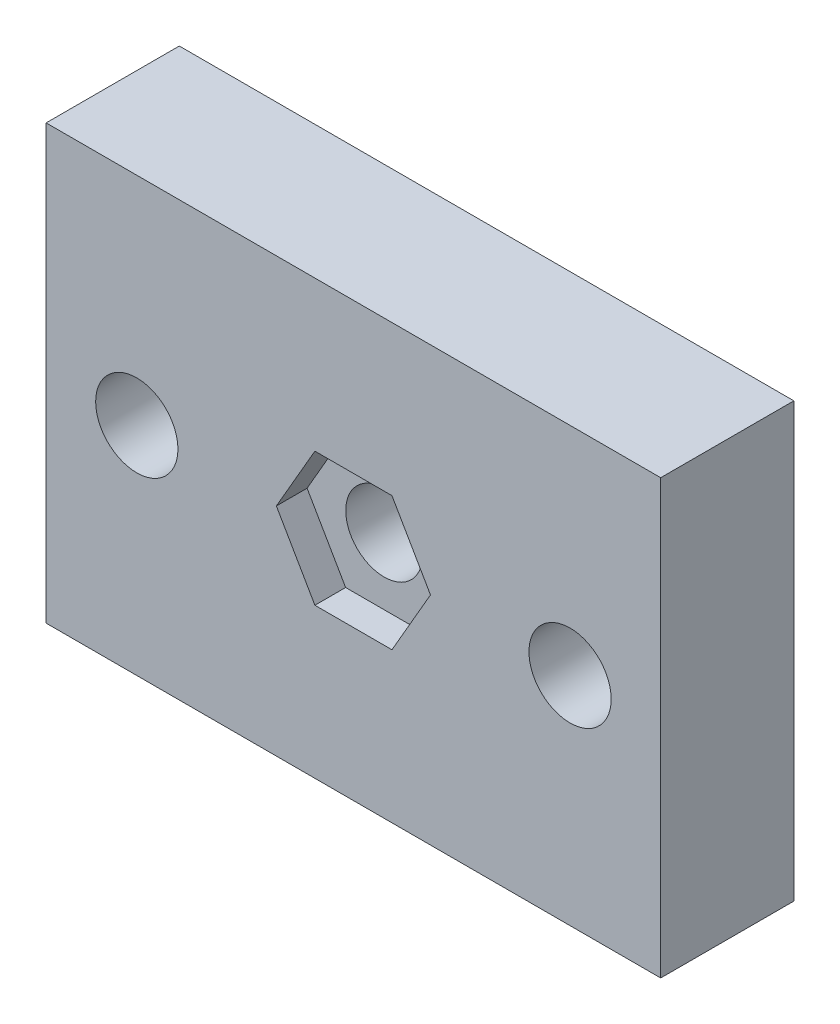
ISO-10303-21;
HEADER;
FILE_DESCRIPTION(('STEP AP214'),'2;1');
FILE_NAME('part.step','',(''),(''),'','','');
FILE_SCHEMA(('AUTOMOTIVE_DESIGN { 1 0 10303 214 1 1 1 1 }'));
ENDSEC;
DATA;
#1=APPLICATION_CONTEXT('core data for automotive mechanical design processes');
#2=APPLICATION_PROTOCOL_DEFINITION('international standard','automotive_design',2000,#1);
#3=PRODUCT_CONTEXT('',#1,'mechanical');
#4=PRODUCT('Part','Part','',(#3));
#5=PRODUCT_RELATED_PRODUCT_CATEGORY('part','',(#4));
#6=PRODUCT_DEFINITION_FORMATION('','',#4);
#7=PRODUCT_DEFINITION_CONTEXT('part definition',#1,'design');
#8=PRODUCT_DEFINITION('design','',#6,#7);
#9=PRODUCT_DEFINITION_SHAPE('','',#8);
#10=(LENGTH_UNIT() NAMED_UNIT(*) SI_UNIT(.MILLI.,.METRE.));
#11=(NAMED_UNIT(*) PLANE_ANGLE_UNIT() SI_UNIT($,.RADIAN.));
#12=(NAMED_UNIT(*) SI_UNIT($,.STERADIAN.) SOLID_ANGLE_UNIT());
#13=UNCERTAINTY_MEASURE_WITH_UNIT(LENGTH_MEASURE(1.E-05),#10,'distance_accuracy_value','');
#14=(GEOMETRIC_REPRESENTATION_CONTEXT(3) GLOBAL_UNCERTAINTY_ASSIGNED_CONTEXT((#13)) GLOBAL_UNIT_ASSIGNED_CONTEXT((#10,
#11,#12)) REPRESENTATION_CONTEXT('',''));
#15=CARTESIAN_POINT('',(0.,0.,0.));
#16=DIRECTION('',(0.,0.,1.));
#17=DIRECTION('',(1.,0.,0.));
#18=AXIS2_PLACEMENT_3D('',#15,#16,#17);
#19=CARTESIAN_POINT('',(1.55341812400635,-2.1856120826709,0.));
#20=DIRECTION('',(0.,0.,1.));
#21=DIRECTION('',(1.,0.,0.));
#22=AXIS2_PLACEMENT_3D('',#19,#20,#21);
#23=CYLINDRICAL_SURFACE('',#22,3.75);
#24=CARTESIAN_POINT('',(1.55341812400635,-2.1856120826709,10.));
#25=DIRECTION('',(0.,0.,1.));
#26=DIRECTION('',(1.,0.,0.));
#27=AXIS2_PLACEMENT_3D('',#24,#25,#26);
#28=CIRCLE('',#27,3.75);
#29=CARTESIAN_POINT('',(5.30341812400635,-2.1856120826709,10.));
#30=VERTEX_POINT('',#29);
#31=EDGE_CURVE('E209',#30,#30,#28,.T.);
#32=ORIENTED_EDGE('',*,*,#31,.T.);
#33=EDGE_LOOP('',(#32));
#34=FACE_BOUND('',#33,.T.);
#35=CARTESIAN_POINT('',(1.55341812400635,-2.1856120826709,3.));
#36=DIRECTION('',(0.,0.,-1.));
#37=DIRECTION('',(-1.,0.,0.));
#38=AXIS2_PLACEMENT_3D('',#35,#36,#37);
#39=CIRCLE('',#38,3.75);
#40=CARTESIAN_POINT('',(-2.19658187599365,-2.1856120826709,3.));
#41=VERTEX_POINT('',#40);
#42=EDGE_CURVE('E44',#41,#41,#39,.F.);
#43=ORIENTED_EDGE('',*,*,#42,.F.);
#44=EDGE_LOOP('',(#43));
#45=FACE_BOUND('',#44,.T.);
#46=ADVANCED_FACE('F40',(#34,#45),#23,.F.);
#47=CARTESIAN_POINT('',(-28.4465818759937,18.9643879173291,13.));
#48=DIRECTION('',(1.,0.,0.));
#49=DIRECTION('',(0.,0.,-1.));
#50=AXIS2_PLACEMENT_3D('',#47,#48,#49);
#51=PLANE('',#50);
#52=DIRECTION('',(0.,-1.,0.));
#53=VECTOR('',#52,1.);
#54=CARTESIAN_POINT('',(-28.4465818759937,18.9643879173291,0.));
#55=LINE('',#54,#53);
#56=CARTESIAN_POINT('',(-28.4465818759937,18.9643879173291,0.));
#57=VERTEX_POINT('',#56);
#58=CARTESIAN_POINT('',(-28.4465818759937,-23.3356120826709,0.));
#59=VERTEX_POINT('',#58);
#60=EDGE_CURVE('E262',#57,#59,#55,.T.);
#61=ORIENTED_EDGE('',*,*,#60,.T.);
#62=DIRECTION('',(0.,0.,-1.));
#63=VECTOR('',#62,1.);
#64=CARTESIAN_POINT('',(-28.4465818759937,-23.3356120826709,13.));
#65=LINE('',#64,#63);
#66=CARTESIAN_POINT('',(-28.4465818759937,-23.3356120826709,13.));
#67=VERTEX_POINT('',#66);
#68=EDGE_CURVE('E11',#67,#59,#65,.T.);
#69=ORIENTED_EDGE('',*,*,#68,.F.);
#70=DIRECTION('',(0.,-1.,0.));
#71=VECTOR('',#70,1.);
#72=CARTESIAN_POINT('',(-28.4465818759937,18.9643879173291,13.));
#73=LINE('',#72,#71);
#74=CARTESIAN_POINT('',(-28.4465818759937,18.9643879173291,13.));
#75=VERTEX_POINT('',#74);
#76=EDGE_CURVE('E271',#75,#67,#73,.T.);
#77=ORIENTED_EDGE('',*,*,#76,.F.);
#78=DIRECTION('',(0.,0.,-1.));
#79=VECTOR('',#78,1.);
#80=CARTESIAN_POINT('',(-28.4465818759937,18.9643879173291,13.));
#81=LINE('',#80,#79);
#82=EDGE_CURVE('E281',#75,#57,#81,.T.);
#83=ORIENTED_EDGE('',*,*,#82,.T.);
#84=EDGE_LOOP('',(#61,#69,#77,#83));
#85=FACE_BOUND('',#84,.T.);
#86=ADVANCED_FACE('F42',(#85),#51,.F.);
#87=CARTESIAN_POINT('',(-28.4465818759937,-23.3356120826709,13.));
#88=DIRECTION('',(0.,1.,0.));
#89=DIRECTION('',(0.,0.,1.));
#90=AXIS2_PLACEMENT_3D('',#87,#88,#89);
#91=PLANE('',#90);
#92=DIRECTION('',(1.,0.,0.));
#93=VECTOR('',#92,1.);
#94=CARTESIAN_POINT('',(-28.4465818759937,-23.3356120826709,0.));
#95=LINE('',#94,#93);
#96=CARTESIAN_POINT('',(31.5534181240064,-23.3356120826709,0.));
#97=VERTEX_POINT('',#96);
#98=EDGE_CURVE('E284',#59,#97,#95,.T.);
#99=ORIENTED_EDGE('',*,*,#98,.T.);
#100=DIRECTION('',(0.,0.,-1.));
#101=VECTOR('',#100,1.);
#102=CARTESIAN_POINT('',(31.5534181240064,-23.3356120826709,13.));
#103=LINE('',#102,#101);
#104=CARTESIAN_POINT('',(31.5534181240064,-23.3356120826709,13.));
#105=VERTEX_POINT('',#104);
#106=EDGE_CURVE('E49',#105,#97,#103,.T.);
#107=ORIENTED_EDGE('',*,*,#106,.F.);
#108=DIRECTION('',(1.,0.,0.));
#109=VECTOR('',#108,1.);
#110=CARTESIAN_POINT('',(-28.4465818759937,-23.3356120826709,13.));
#111=LINE('',#110,#109);
#112=EDGE_CURVE('E274',#67,#105,#111,.T.);
#113=ORIENTED_EDGE('',*,*,#112,.F.);
#114=ORIENTED_EDGE('',*,*,#68,.T.);
#115=EDGE_LOOP('',(#99,#107,#113,#114));
#116=FACE_BOUND('',#115,.T.);
#117=ADVANCED_FACE('F315',(#116),#91,.F.);
#118=CARTESIAN_POINT('',(31.5534181240063,18.9643879173291,13.));
#119=DIRECTION('',(-1.,0.,0.));
#120=DIRECTION('',(0.,-1.,0.));
#121=AXIS2_PLACEMENT_3D('',#118,#119,#120);
#122=PLANE('',#121);
#123=DIRECTION('',(0.,1.,0.));
#124=VECTOR('',#123,1.);
#125=CARTESIAN_POINT('',(31.5534181240063,18.9643879173291,0.));
#126=LINE('',#125,#124);
#127=CARTESIAN_POINT('',(31.5534181240063,18.9643879173291,0.));
#128=VERTEX_POINT('',#127);
#129=EDGE_CURVE('E286',#97,#128,#126,.T.);
#130=ORIENTED_EDGE('',*,*,#129,.T.);
#131=DIRECTION('',(0.,0.,-1.));
#132=VECTOR('',#131,1.);
#133=CARTESIAN_POINT('',(31.5534181240063,18.9643879173291,13.));
#134=LINE('',#133,#132);
#135=CARTESIAN_POINT('',(31.5534181240063,18.9643879173291,13.));
#136=VERTEX_POINT('',#135);
#137=EDGE_CURVE('E291',#136,#128,#134,.T.);
#138=ORIENTED_EDGE('',*,*,#137,.F.);
#139=DIRECTION('',(0.,1.,0.));
#140=VECTOR('',#139,1.);
#141=CARTESIAN_POINT('',(31.5534181240063,18.9643879173291,13.));
#142=LINE('',#141,#140);
#143=EDGE_CURVE('E277',#105,#136,#142,.T.);
#144=ORIENTED_EDGE('',*,*,#143,.F.);
#145=ORIENTED_EDGE('',*,*,#106,.T.);
#146=EDGE_LOOP('',(#130,#138,#144,#145));
#147=FACE_BOUND('',#146,.T.);
#148=ADVANCED_FACE('F299',(#147),#122,.F.);
#149=CARTESIAN_POINT('',(-28.4465818759937,18.9643879173291,13.));
#150=DIRECTION('',(0.,-1.,0.));
#151=DIRECTION('',(0.,0.,-1.));
#152=AXIS2_PLACEMENT_3D('',#149,#150,#151);
#153=PLANE('',#152);
#154=DIRECTION('',(-1.,0.,0.));
#155=VECTOR('',#154,1.);
#156=CARTESIAN_POINT('',(-28.4465818759937,18.9643879173291,0.));
#157=LINE('',#156,#155);
#158=EDGE_CURVE('E275',#128,#57,#157,.T.);
#159=ORIENTED_EDGE('',*,*,#158,.T.);
#160=ORIENTED_EDGE('',*,*,#82,.F.);
#161=DIRECTION('',(-1.,0.,0.));
#162=VECTOR('',#161,1.);
#163=CARTESIAN_POINT('',(-28.4465818759937,18.9643879173291,13.));
#164=LINE('',#163,#162);
#165=EDGE_CURVE('E279',#136,#75,#164,.T.);
#166=ORIENTED_EDGE('',*,*,#165,.F.);
#167=ORIENTED_EDGE('',*,*,#137,.T.);
#168=EDGE_LOOP('',(#159,#160,#166,#167));
#169=FACE_BOUND('',#168,.T.);
#170=ADVANCED_FACE('F308',(#169),#153,.F.);
#171=CARTESIAN_POINT('',(0.,0.,13.));
#172=DIRECTION('',(0.,0.,1.));
#173=DIRECTION('',(1.,0.,0.));
#174=AXIS2_PLACEMENT_3D('',#171,#172,#173);
#175=PLANE('',#174);
#176=DIRECTION('',(0.5,0.866025403784439,0.));
#177=VECTOR('',#176,1.);
#178=CARTESIAN_POINT('',(5.31485512777676,-8.7006120826709,13.));
#179=LINE('',#178,#177);
#180=CARTESIAN_POINT('',(5.31485512777676,-8.7006120826709,13.));
#181=VERTEX_POINT('',#180);
#182=CARTESIAN_POINT('',(9.07629213154717,-2.1856120826709,13.));
#183=VERTEX_POINT('',#182);
#184=EDGE_CURVE('E64',#181,#183,#179,.T.);
#185=ORIENTED_EDGE('',*,*,#184,.F.);
#186=DIRECTION('',(1.,0.,0.));
#187=VECTOR('',#186,1.);
#188=CARTESIAN_POINT('',(-2.20801887976406,-8.7006120826709,13.));
#189=LINE('',#188,#187);
#190=CARTESIAN_POINT('',(-2.20801887976406,-8.7006120826709,13.));
#191=VERTEX_POINT('',#190);
#192=EDGE_CURVE('E216',#191,#181,#189,.T.);
#193=ORIENTED_EDGE('',*,*,#192,.F.);
#194=DIRECTION('',(0.5,-0.866025403784439,0.));
#195=VECTOR('',#194,1.);
#196=CARTESIAN_POINT('',(-5.96945588353448,-2.18561208267091,13.));
#197=LINE('',#196,#195);
#198=CARTESIAN_POINT('',(-5.96945588353448,-2.18561208267091,13.));
#199=VERTEX_POINT('',#198);
#200=EDGE_CURVE('E242',#199,#191,#197,.T.);
#201=ORIENTED_EDGE('',*,*,#200,.F.);
#202=DIRECTION('',(-0.5,-0.866025403784439,0.));
#203=VECTOR('',#202,1.);
#204=CARTESIAN_POINT('',(-2.20801887976407,4.3293879173291,13.));
#205=LINE('',#204,#203);
#206=CARTESIAN_POINT('',(-2.20801887976407,4.3293879173291,13.));
#207=VERTEX_POINT('',#206);
#208=EDGE_CURVE('E239',#207,#199,#205,.T.);
#209=ORIENTED_EDGE('',*,*,#208,.F.);
#210=DIRECTION('',(-1.,0.,0.));
#211=VECTOR('',#210,1.);
#212=CARTESIAN_POINT('',(5.31485512777676,4.3293879173291,13.));
#213=LINE('',#212,#211);
#214=CARTESIAN_POINT('',(5.31485512777676,4.3293879173291,13.));
#215=VERTEX_POINT('',#214);
#216=EDGE_CURVE('E236',#215,#207,#213,.T.);
#217=ORIENTED_EDGE('',*,*,#216,.F.);
#218=DIRECTION('',(-0.5,0.866025403784438,0.));
#219=VECTOR('',#218,1.);
#220=CARTESIAN_POINT('',(9.07629213154717,-2.1856120826709,13.));
#221=LINE('',#220,#219);
#222=EDGE_CURVE('E233',#183,#215,#221,.T.);
#223=ORIENTED_EDGE('',*,*,#222,.F.);
#224=EDGE_LOOP('',(#185,#193,#201,#209,#217,#223));
#225=FACE_BOUND('',#224,.T.);
#226=CARTESIAN_POINT('',(22.7034181240063,-2.1856120826709,13.));
#227=DIRECTION('',(0.,0.,1.));
#228=DIRECTION('',(1.,0.,0.));
#229=AXIS2_PLACEMENT_3D('',#226,#227,#228);
#230=CIRCLE('',#229,4.015);
#231=CARTESIAN_POINT('',(26.7184181240063,-2.1856120826709,13.));
#232=VERTEX_POINT('',#231);
#233=EDGE_CURVE('E263',#232,#232,#230,.T.);
#234=ORIENTED_EDGE('',*,*,#233,.F.);
#235=EDGE_LOOP('',(#234));
#236=FACE_BOUND('',#235,.T.);
#237=CARTESIAN_POINT('',(-19.5965818759936,-2.1856120826709,13.));
#238=DIRECTION('',(0.,0.,1.));
#239=DIRECTION('',(-1.,0.,0.));
#240=AXIS2_PLACEMENT_3D('',#237,#238,#239);
#241=CIRCLE('',#240,4.015);
#242=CARTESIAN_POINT('',(-23.6115818759937,-2.1856120826709,13.));
#243=VERTEX_POINT('',#242);
#244=EDGE_CURVE('E266',#243,#243,#241,.T.);
#245=ORIENTED_EDGE('',*,*,#244,.F.);
#246=EDGE_LOOP('',(#245));
#247=FACE_BOUND('',#246,.T.);
#248=ORIENTED_EDGE('',*,*,#76,.T.);
#249=ORIENTED_EDGE('',*,*,#112,.T.);
#250=ORIENTED_EDGE('',*,*,#143,.T.);
#251=ORIENTED_EDGE('',*,*,#165,.T.);
#252=EDGE_LOOP('',(#248,#249,#250,#251));
#253=FACE_BOUND('',#252,.T.);
#254=ADVANCED_FACE('F314',(#225,#236,#247,#253),#175,.T.);
#255=CARTESIAN_POINT('',(0.,0.,0.));
#256=DIRECTION('',(0.,0.,1.));
#257=DIRECTION('',(1.,0.,0.));
#258=AXIS2_PLACEMENT_3D('',#255,#256,#257);
#259=PLANE('',#258);
#260=DIRECTION('',(0.5,0.866025403784438,0.));
#261=VECTOR('',#260,1.);
#262=CARTESIAN_POINT('',(-5.96945588353448,-2.1856120826709,0.));
#263=LINE('',#262,#261);
#264=CARTESIAN_POINT('',(-5.96945588353448,-2.1856120826709,0.));
#265=VERTEX_POINT('',#264);
#266=CARTESIAN_POINT('',(-2.20801887976406,4.3293879173291,0.));
#267=VERTEX_POINT('',#266);
#268=EDGE_CURVE('E190',#265,#267,#263,.T.);
#269=ORIENTED_EDGE('',*,*,#268,.F.);
#270=DIRECTION('',(-0.5,0.866025403784439,0.));
#271=VECTOR('',#270,1.);
#272=CARTESIAN_POINT('',(-2.20801887976407,-8.7006120826709,0.));
#273=LINE('',#272,#271);
#274=CARTESIAN_POINT('',(-2.20801887976407,-8.7006120826709,0.));
#275=VERTEX_POINT('',#274);
#276=EDGE_CURVE('E56',#275,#265,#273,.T.);
#277=ORIENTED_EDGE('',*,*,#276,.F.);
#278=DIRECTION('',(-1.,0.,0.));
#279=VECTOR('',#278,1.);
#280=CARTESIAN_POINT('',(5.31485512777676,-8.7006120826709,0.));
#281=LINE('',#280,#279);
#282=CARTESIAN_POINT('',(5.31485512777676,-8.7006120826709,0.));
#283=VERTEX_POINT('',#282);
#284=EDGE_CURVE('E176',#283,#275,#281,.T.);
#285=ORIENTED_EDGE('',*,*,#284,.F.);
#286=DIRECTION('',(-0.5,-0.866025403784439,0.));
#287=VECTOR('',#286,1.);
#288=CARTESIAN_POINT('',(9.07629213154717,-2.1856120826709,0.));
#289=LINE('',#288,#287);
#290=CARTESIAN_POINT('',(9.07629213154717,-2.1856120826709,0.));
#291=VERTEX_POINT('',#290);
#292=EDGE_CURVE('E179',#291,#283,#289,.T.);
#293=ORIENTED_EDGE('',*,*,#292,.F.);
#294=DIRECTION('',(0.5,-0.866025403784439,0.));
#295=VECTOR('',#294,1.);
#296=CARTESIAN_POINT('',(5.31485512777676,4.3293879173291,0.));
#297=LINE('',#296,#295);
#298=CARTESIAN_POINT('',(5.31485512777676,4.3293879173291,0.));
#299=VERTEX_POINT('',#298);
#300=EDGE_CURVE('E195',#299,#291,#297,.T.);
#301=ORIENTED_EDGE('',*,*,#300,.F.);
#302=DIRECTION('',(1.,0.,0.));
#303=VECTOR('',#302,1.);
#304=CARTESIAN_POINT('',(-2.20801887976406,4.3293879173291,0.));
#305=LINE('',#304,#303);
#306=EDGE_CURVE('E192',#267,#299,#305,.T.);
#307=ORIENTED_EDGE('',*,*,#306,.F.);
#308=EDGE_LOOP('',(#269,#277,#285,#293,#301,#307));
#309=FACE_BOUND('',#308,.T.);
#310=ORIENTED_EDGE('',*,*,#60,.F.);
#311=ORIENTED_EDGE('',*,*,#158,.F.);
#312=ORIENTED_EDGE('',*,*,#129,.F.);
#313=ORIENTED_EDGE('',*,*,#98,.F.);
#314=EDGE_LOOP('',(#310,#311,#312,#313));
#315=FACE_BOUND('',#314,.T.);
#316=ADVANCED_FACE('F305',(#309,#315),#259,.F.);
#317=CARTESIAN_POINT('',(-19.5965818759936,-2.1856120826709,3.));
#318=DIRECTION('',(0.,0.,1.));
#319=DIRECTION('',(1.,0.,0.));
#320=AXIS2_PLACEMENT_3D('',#317,#318,#319);
#321=CYLINDRICAL_SURFACE('',#320,4.015);
#322=CARTESIAN_POINT('',(-19.5965818759936,-2.1856120826709,3.));
#323=DIRECTION('',(0.,0.,1.));
#324=DIRECTION('',(-1.,0.,0.));
#325=AXIS2_PLACEMENT_3D('',#322,#323,#324);
#326=CIRCLE('',#325,4.015);
#327=CARTESIAN_POINT('',(-23.6115818759937,-2.1856120826709,3.));
#328=VERTEX_POINT('',#327);
#329=EDGE_CURVE('E249',#328,#328,#326,.T.);
#330=ORIENTED_EDGE('',*,*,#329,.F.);
#331=EDGE_LOOP('',(#330));
#332=FACE_BOUND('',#331,.T.);
#333=ORIENTED_EDGE('',*,*,#244,.T.);
#334=EDGE_LOOP('',(#333));
#335=FACE_BOUND('',#334,.T.);
#336=ADVANCED_FACE('F367',(#332,#335),#321,.F.);
#337=CARTESIAN_POINT('',(-19.5965818759936,-2.1856120826709,3.));
#338=DIRECTION('',(0.,0.,-1.));
#339=DIRECTION('',(-1.,0.,0.));
#340=AXIS2_PLACEMENT_3D('',#337,#338,#339);
#341=PLANE('',#340);
#342=ORIENTED_EDGE('',*,*,#329,.T.);
#343=EDGE_LOOP('',(#342));
#344=FACE_BOUND('',#343,.T.);
#345=ADVANCED_FACE('F365',(#344),#341,.F.);
#346=CARTESIAN_POINT('',(22.7034181240063,-2.1856120826709,3.));
#347=DIRECTION('',(0.,0.,1.));
#348=DIRECTION('',(1.,0.,0.));
#349=AXIS2_PLACEMENT_3D('',#346,#347,#348);
#350=CYLINDRICAL_SURFACE('',#349,4.015);
#351=CARTESIAN_POINT('',(22.7034181240063,-2.1856120826709,3.));
#352=DIRECTION('',(0.,0.,1.));
#353=DIRECTION('',(1.,0.,0.));
#354=AXIS2_PLACEMENT_3D('',#351,#352,#353);
#355=CIRCLE('',#354,4.015);
#356=CARTESIAN_POINT('',(26.7184181240063,-2.1856120826709,3.));
#357=VERTEX_POINT('',#356);
#358=EDGE_CURVE('E259',#357,#357,#355,.T.);
#359=ORIENTED_EDGE('',*,*,#358,.F.);
#360=EDGE_LOOP('',(#359));
#361=FACE_BOUND('',#360,.T.);
#362=ORIENTED_EDGE('',*,*,#233,.T.);
#363=EDGE_LOOP('',(#362));
#364=FACE_BOUND('',#363,.T.);
#365=ADVANCED_FACE('F361',(#361,#364),#350,.F.);
#366=CARTESIAN_POINT('',(22.7034181240063,-2.1856120826709,3.));
#367=DIRECTION('',(0.,0.,1.));
#368=DIRECTION('',(1.,0.,0.));
#369=AXIS2_PLACEMENT_3D('',#366,#367,#368);
#370=PLANE('',#369);
#371=ORIENTED_EDGE('',*,*,#358,.T.);
#372=EDGE_LOOP('',(#371));
#373=FACE_BOUND('',#372,.T.);
#374=ADVANCED_FACE('F358',(#373),#370,.T.);
#375=CARTESIAN_POINT('',(5.31485512777676,-8.7006120826709,10.));
#376=DIRECTION('',(0.866025403784439,-0.5,0.));
#377=DIRECTION('',(0.5,0.866025403784439,0.));
#378=AXIS2_PLACEMENT_3D('',#375,#376,#377);
#379=PLANE('',#378);
#380=ORIENTED_EDGE('',*,*,#184,.T.);
#381=DIRECTION('',(0.,0.,1.));
#382=VECTOR('',#381,1.);
#383=CARTESIAN_POINT('',(9.07629213154717,-2.1856120826709,10.));
#384=LINE('',#383,#382);
#385=CARTESIAN_POINT('',(9.07629213154717,-2.1856120826709,10.));
#386=VERTEX_POINT('',#385);
#387=EDGE_CURVE('E231',#386,#183,#384,.T.);
#388=ORIENTED_EDGE('',*,*,#387,.F.);
#389=DIRECTION('',(0.5,0.866025403784439,0.));
#390=VECTOR('',#389,1.);
#391=CARTESIAN_POINT('',(5.31485512777676,-8.7006120826709,10.));
#392=LINE('',#391,#390);
#393=CARTESIAN_POINT('',(5.31485512777676,-8.7006120826709,10.));
#394=VERTEX_POINT('',#393);
#395=EDGE_CURVE('E212',#394,#386,#392,.T.);
#396=ORIENTED_EDGE('',*,*,#395,.F.);
#397=DIRECTION('',(0.,0.,1.));
#398=VECTOR('',#397,1.);
#399=CARTESIAN_POINT('',(5.31485512777676,-8.7006120826709,10.));
#400=LINE('',#399,#398);
#401=EDGE_CURVE('E247',#394,#181,#400,.T.);
#402=ORIENTED_EDGE('',*,*,#401,.T.);
#403=EDGE_LOOP('',(#380,#388,#396,#402));
#404=FACE_BOUND('',#403,.T.);
#405=ADVANCED_FACE('F340',(#404),#379,.F.);
#406=CARTESIAN_POINT('',(-2.20801887976406,-8.7006120826709,10.));
#407=DIRECTION('',(0.,-1.,0.));
#408=DIRECTION('',(0.,0.,-1.));
#409=AXIS2_PLACEMENT_3D('',#406,#407,#408);
#410=PLANE('',#409);
#411=ORIENTED_EDGE('',*,*,#192,.T.);
#412=ORIENTED_EDGE('',*,*,#401,.F.);
#413=DIRECTION('',(1.,0.,0.));
#414=VECTOR('',#413,1.);
#415=CARTESIAN_POINT('',(-2.20801887976406,-8.7006120826709,10.));
#416=LINE('',#415,#414);
#417=CARTESIAN_POINT('',(-2.20801887976406,-8.7006120826709,10.));
#418=VERTEX_POINT('',#417);
#419=EDGE_CURVE('E228',#418,#394,#416,.T.);
#420=ORIENTED_EDGE('',*,*,#419,.F.);
#421=DIRECTION('',(0.,0.,1.));
#422=VECTOR('',#421,1.);
#423=CARTESIAN_POINT('',(-2.20801887976406,-8.7006120826709,10.));
#424=LINE('',#423,#422);
#425=EDGE_CURVE('E250',#418,#191,#424,.T.);
#426=ORIENTED_EDGE('',*,*,#425,.T.);
#427=EDGE_LOOP('',(#411,#412,#420,#426));
#428=FACE_BOUND('',#427,.T.);
#429=ADVANCED_FACE('F336',(#428),#410,.F.);
#430=CARTESIAN_POINT('',(-5.96945588353448,-2.18561208267091,10.));
#431=DIRECTION('',(-0.866025403784438,-0.5,0.));
#432=DIRECTION('',(0.5,-0.866025403784439,0.));
#433=AXIS2_PLACEMENT_3D('',#430,#431,#432);
#434=PLANE('',#433);
#435=ORIENTED_EDGE('',*,*,#200,.T.);
#436=ORIENTED_EDGE('',*,*,#425,.F.);
#437=DIRECTION('',(0.5,-0.866025403784439,0.));
#438=VECTOR('',#437,1.);
#439=CARTESIAN_POINT('',(-5.96945588353448,-2.18561208267091,10.));
#440=LINE('',#439,#438);
#441=CARTESIAN_POINT('',(-5.96945588353448,-2.18561208267091,10.));
#442=VERTEX_POINT('',#441);
#443=EDGE_CURVE('E225',#442,#418,#440,.T.);
#444=ORIENTED_EDGE('',*,*,#443,.F.);
#445=DIRECTION('',(0.,0.,1.));
#446=VECTOR('',#445,1.);
#447=CARTESIAN_POINT('',(-5.96945588353448,-2.18561208267091,10.));
#448=LINE('',#447,#446);
#449=EDGE_CURVE('E252',#442,#199,#448,.T.);
#450=ORIENTED_EDGE('',*,*,#449,.T.);
#451=EDGE_LOOP('',(#435,#436,#444,#450));
#452=FACE_BOUND('',#451,.T.);
#453=ADVANCED_FACE('F339',(#452),#434,.F.);
#454=CARTESIAN_POINT('',(-2.20801887976407,4.3293879173291,10.));
#455=DIRECTION('',(-0.866025403784439,0.5,0.));
#456=DIRECTION('',(-0.5,-0.866025403784439,0.));
#457=AXIS2_PLACEMENT_3D('',#454,#455,#456);
#458=PLANE('',#457);
#459=ORIENTED_EDGE('',*,*,#208,.T.);
#460=ORIENTED_EDGE('',*,*,#449,.F.);
#461=DIRECTION('',(-0.5,-0.866025403784439,0.));
#462=VECTOR('',#461,1.);
#463=CARTESIAN_POINT('',(-2.20801887976407,4.3293879173291,10.));
#464=LINE('',#463,#462);
#465=CARTESIAN_POINT('',(-2.20801887976407,4.3293879173291,10.));
#466=VERTEX_POINT('',#465);
#467=EDGE_CURVE('E222',#466,#442,#464,.T.);
#468=ORIENTED_EDGE('',*,*,#467,.F.);
#469=DIRECTION('',(0.,0.,1.));
#470=VECTOR('',#469,1.);
#471=CARTESIAN_POINT('',(-2.20801887976407,4.3293879173291,10.));
#472=LINE('',#471,#470);
#473=EDGE_CURVE('E254',#466,#207,#472,.T.);
#474=ORIENTED_EDGE('',*,*,#473,.T.);
#475=EDGE_LOOP('',(#459,#460,#468,#474));
#476=FACE_BOUND('',#475,.T.);
#477=ADVANCED_FACE('F344',(#476),#458,.F.);
#478=CARTESIAN_POINT('',(5.31485512777676,4.3293879173291,10.));
#479=DIRECTION('',(0.,1.,0.));
#480=DIRECTION('',(0.,0.,1.));
#481=AXIS2_PLACEMENT_3D('',#478,#479,#480);
#482=PLANE('',#481);
#483=ORIENTED_EDGE('',*,*,#216,.T.);
#484=ORIENTED_EDGE('',*,*,#473,.F.);
#485=DIRECTION('',(-1.,0.,0.));
#486=VECTOR('',#485,1.);
#487=CARTESIAN_POINT('',(5.31485512777676,4.3293879173291,10.));
#488=LINE('',#487,#486);
#489=CARTESIAN_POINT('',(5.31485512777676,4.3293879173291,10.));
#490=VERTEX_POINT('',#489);
#491=EDGE_CURVE('E219',#490,#466,#488,.T.);
#492=ORIENTED_EDGE('',*,*,#491,.F.);
#493=DIRECTION('',(0.,0.,1.));
#494=VECTOR('',#493,1.);
#495=CARTESIAN_POINT('',(5.31485512777676,4.3293879173291,10.));
#496=LINE('',#495,#494);
#497=EDGE_CURVE('E256',#490,#215,#496,.T.);
#498=ORIENTED_EDGE('',*,*,#497,.T.);
#499=EDGE_LOOP('',(#483,#484,#492,#498));
#500=FACE_BOUND('',#499,.T.);
#501=ADVANCED_FACE('F348',(#500),#482,.F.);
#502=CARTESIAN_POINT('',(9.07629213154717,-2.1856120826709,10.));
#503=DIRECTION('',(0.866025403784439,0.5,0.));
#504=DIRECTION('',(-0.5,0.866025403784439,0.));
#505=AXIS2_PLACEMENT_3D('',#502,#503,#504);
#506=PLANE('',#505);
#507=ORIENTED_EDGE('',*,*,#222,.T.);
#508=ORIENTED_EDGE('',*,*,#497,.F.);
#509=DIRECTION('',(-0.5,0.866025403784438,0.));
#510=VECTOR('',#509,1.);
#511=CARTESIAN_POINT('',(9.07629213154717,-2.1856120826709,10.));
#512=LINE('',#511,#510);
#513=EDGE_CURVE('E215',#386,#490,#512,.T.);
#514=ORIENTED_EDGE('',*,*,#513,.F.);
#515=ORIENTED_EDGE('',*,*,#387,.T.);
#516=EDGE_LOOP('',(#507,#508,#514,#515));
#517=FACE_BOUND('',#516,.T.);
#518=ADVANCED_FACE('F334',(#517),#506,.F.);
#519=CARTESIAN_POINT('',(0.,0.,10.));
#520=DIRECTION('',(0.,0.,1.));
#521=DIRECTION('',(1.,0.,0.));
#522=AXIS2_PLACEMENT_3D('',#519,#520,#521);
#523=PLANE('',#522);
#524=ORIENTED_EDGE('',*,*,#31,.F.);
#525=EDGE_LOOP('',(#524));
#526=FACE_BOUND('',#525,.T.);
#527=ORIENTED_EDGE('',*,*,#395,.T.);
#528=ORIENTED_EDGE('',*,*,#513,.T.);
#529=ORIENTED_EDGE('',*,*,#491,.T.);
#530=ORIENTED_EDGE('',*,*,#467,.T.);
#531=ORIENTED_EDGE('',*,*,#443,.T.);
#532=ORIENTED_EDGE('',*,*,#419,.T.);
#533=EDGE_LOOP('',(#527,#528,#529,#530,#531,#532));
#534=FACE_BOUND('',#533,.T.);
#535=ADVANCED_FACE('F331',(#526,#534),#523,.T.);
#536=CARTESIAN_POINT('',(0.,0.,3.));
#537=DIRECTION('',(0.,0.,-1.));
#538=DIRECTION('',(-1.,0.,0.));
#539=AXIS2_PLACEMENT_3D('',#536,#537,#538);
#540=PLANE('',#539);
#541=DIRECTION('',(-0.5,0.866025403784439,0.));
#542=VECTOR('',#541,1.);
#543=CARTESIAN_POINT('',(-2.20801887976407,-8.7006120826709,3.));
#544=LINE('',#543,#542);
#545=CARTESIAN_POINT('',(-2.20801887976407,-8.7006120826709,3.));
#546=VERTEX_POINT('',#545);
#547=CARTESIAN_POINT('',(-5.96945588353448,-2.1856120826709,3.));
#548=VERTEX_POINT('',#547);
#549=EDGE_CURVE('E156',#546,#548,#544,.T.);
#550=ORIENTED_EDGE('',*,*,#549,.T.);
#551=DIRECTION('',(0.5,0.866025403784438,0.));
#552=VECTOR('',#551,1.);
#553=CARTESIAN_POINT('',(-5.96945588353448,-2.1856120826709,3.));
#554=LINE('',#553,#552);
#555=CARTESIAN_POINT('',(-2.20801887976406,4.3293879173291,3.));
#556=VERTEX_POINT('',#555);
#557=EDGE_CURVE('E165',#548,#556,#554,.T.);
#558=ORIENTED_EDGE('',*,*,#557,.T.);
#559=DIRECTION('',(1.,0.,0.));
#560=VECTOR('',#559,1.);
#561=CARTESIAN_POINT('',(-2.20801887976406,4.3293879173291,3.));
#562=LINE('',#561,#560);
#563=CARTESIAN_POINT('',(5.31485512777676,4.3293879173291,3.));
#564=VERTEX_POINT('',#563);
#565=EDGE_CURVE('E170',#556,#564,#562,.T.);
#566=ORIENTED_EDGE('',*,*,#565,.T.);
#567=DIRECTION('',(0.5,-0.866025403784439,0.));
#568=VECTOR('',#567,1.);
#569=CARTESIAN_POINT('',(5.31485512777676,4.3293879173291,3.));
#570=LINE('',#569,#568);
#571=CARTESIAN_POINT('',(9.07629213154717,-2.1856120826709,3.));
#572=VERTEX_POINT('',#571);
#573=EDGE_CURVE('E183',#564,#572,#570,.T.);
#574=ORIENTED_EDGE('',*,*,#573,.T.);
#575=DIRECTION('',(-0.5,-0.866025403784439,0.));
#576=VECTOR('',#575,1.);
#577=CARTESIAN_POINT('',(9.07629213154717,-2.1856120826709,3.));
#578=LINE('',#577,#576);
#579=CARTESIAN_POINT('',(5.31485512777676,-8.7006120826709,3.));
#580=VERTEX_POINT('',#579);
#581=EDGE_CURVE('E186',#572,#580,#578,.T.);
#582=ORIENTED_EDGE('',*,*,#581,.T.);
#583=DIRECTION('',(-1.,0.,0.));
#584=VECTOR('',#583,1.);
#585=CARTESIAN_POINT('',(5.31485512777676,-8.7006120826709,3.));
#586=LINE('',#585,#584);
#587=EDGE_CURVE('E162',#580,#546,#586,.T.);
#588=ORIENTED_EDGE('',*,*,#587,.T.);
#589=EDGE_LOOP('',(#550,#558,#566,#574,#582,#588));
#590=FACE_BOUND('',#589,.T.);
#591=ORIENTED_EDGE('',*,*,#42,.T.);
#592=EDGE_LOOP('',(#591));
#593=FACE_BOUND('',#592,.T.);
#594=ADVANCED_FACE('F172',(#590,#593),#540,.T.);
#595=CARTESIAN_POINT('',(-2.20801887976407,-8.7006120826709,3.));
#596=DIRECTION('',(-0.866025403784439,-0.5,0.));
#597=DIRECTION('',(0.5,-0.866025403784439,0.));
#598=AXIS2_PLACEMENT_3D('',#595,#596,#597);
#599=PLANE('',#598);
#600=ORIENTED_EDGE('',*,*,#276,.T.);
#601=DIRECTION('',(0.,0.,-1.));
#602=VECTOR('',#601,1.);
#603=CARTESIAN_POINT('',(-5.96945588353448,-2.1856120826709,3.));
#604=LINE('',#603,#602);
#605=EDGE_CURVE('E152',#548,#265,#604,.T.);
#606=ORIENTED_EDGE('',*,*,#605,.F.);
#607=ORIENTED_EDGE('',*,*,#549,.F.);
#608=DIRECTION('',(0.,0.,-1.));
#609=VECTOR('',#608,1.);
#610=CARTESIAN_POINT('',(-2.20801887976407,-8.7006120826709,3.));
#611=LINE('',#610,#609);
#612=EDGE_CURVE('E200',#546,#275,#611,.T.);
#613=ORIENTED_EDGE('',*,*,#612,.T.);
#614=EDGE_LOOP('',(#600,#606,#607,#613));
#615=FACE_BOUND('',#614,.T.);
#616=ADVANCED_FACE('F154',(#615),#599,.F.);
#617=CARTESIAN_POINT('',(5.31485512777676,-8.7006120826709,3.));
#618=DIRECTION('',(0.,-1.,0.));
#619=DIRECTION('',(0.,0.,-1.));
#620=AXIS2_PLACEMENT_3D('',#617,#618,#619);
#621=PLANE('',#620);
#622=ORIENTED_EDGE('',*,*,#284,.T.);
#623=ORIENTED_EDGE('',*,*,#612,.F.);
#624=ORIENTED_EDGE('',*,*,#587,.F.);
#625=DIRECTION('',(0.,0.,-1.));
#626=VECTOR('',#625,1.);
#627=CARTESIAN_POINT('',(5.31485512777676,-8.7006120826709,3.));
#628=LINE('',#627,#626);
#629=EDGE_CURVE('E202',#580,#283,#628,.T.);
#630=ORIENTED_EDGE('',*,*,#629,.T.);
#631=EDGE_LOOP('',(#622,#623,#624,#630));
#632=FACE_BOUND('',#631,.T.);
#633=ADVANCED_FACE('F449',(#632),#621,.F.);
#634=CARTESIAN_POINT('',(9.07629213154717,-2.1856120826709,3.));
#635=DIRECTION('',(0.866025403784439,-0.5,0.));
#636=DIRECTION('',(0.5,0.866025403784439,0.));
#637=AXIS2_PLACEMENT_3D('',#634,#635,#636);
#638=PLANE('',#637);
#639=ORIENTED_EDGE('',*,*,#292,.T.);
#640=ORIENTED_EDGE('',*,*,#629,.F.);
#641=ORIENTED_EDGE('',*,*,#581,.F.);
#642=DIRECTION('',(0.,0.,-1.));
#643=VECTOR('',#642,1.);
#644=CARTESIAN_POINT('',(9.07629213154717,-2.1856120826709,3.));
#645=LINE('',#644,#643);
#646=EDGE_CURVE('E204',#572,#291,#645,.T.);
#647=ORIENTED_EDGE('',*,*,#646,.T.);
#648=EDGE_LOOP('',(#639,#640,#641,#647));
#649=FACE_BOUND('',#648,.T.);
#650=ADVANCED_FACE('F455',(#649),#638,.F.);
#651=CARTESIAN_POINT('',(5.31485512777676,4.3293879173291,3.));
#652=DIRECTION('',(0.866025403784439,0.5,0.));
#653=DIRECTION('',(-0.5,0.866025403784439,0.));
#654=AXIS2_PLACEMENT_3D('',#651,#652,#653);
#655=PLANE('',#654);
#656=ORIENTED_EDGE('',*,*,#300,.T.);
#657=ORIENTED_EDGE('',*,*,#646,.F.);
#658=ORIENTED_EDGE('',*,*,#573,.F.);
#659=DIRECTION('',(0.,0.,-1.));
#660=VECTOR('',#659,1.);
#661=CARTESIAN_POINT('',(5.31485512777676,4.3293879173291,3.));
#662=LINE('',#661,#660);
#663=EDGE_CURVE('E206',#564,#299,#662,.T.);
#664=ORIENTED_EDGE('',*,*,#663,.T.);
#665=EDGE_LOOP('',(#656,#657,#658,#664));
#666=FACE_BOUND('',#665,.T.);
#667=ADVANCED_FACE('F463',(#666),#655,.F.);
#668=CARTESIAN_POINT('',(-2.20801887976406,4.3293879173291,3.));
#669=DIRECTION('',(0.,1.,0.));
#670=DIRECTION('',(0.,0.,1.));
#671=AXIS2_PLACEMENT_3D('',#668,#669,#670);
#672=PLANE('',#671);
#673=ORIENTED_EDGE('',*,*,#306,.T.);
#674=ORIENTED_EDGE('',*,*,#663,.F.);
#675=ORIENTED_EDGE('',*,*,#565,.F.);
#676=DIRECTION('',(0.,0.,-1.));
#677=VECTOR('',#676,1.);
#678=CARTESIAN_POINT('',(-2.20801887976406,4.3293879173291,3.));
#679=LINE('',#678,#677);
#680=EDGE_CURVE('E161',#556,#267,#679,.T.);
#681=ORIENTED_EDGE('',*,*,#680,.T.);
#682=EDGE_LOOP('',(#673,#674,#675,#681));
#683=FACE_BOUND('',#682,.T.);
#684=ADVANCED_FACE('F471',(#683),#672,.F.);
#685=CARTESIAN_POINT('',(-5.96945588353448,-2.1856120826709,3.));
#686=DIRECTION('',(-0.866025403784439,0.5,0.));
#687=DIRECTION('',(-0.5,-0.866025403784439,0.));
#688=AXIS2_PLACEMENT_3D('',#685,#686,#687);
#689=PLANE('',#688);
#690=ORIENTED_EDGE('',*,*,#268,.T.);
#691=ORIENTED_EDGE('',*,*,#680,.F.);
#692=ORIENTED_EDGE('',*,*,#557,.F.);
#693=ORIENTED_EDGE('',*,*,#605,.T.);
#694=EDGE_LOOP('',(#690,#691,#692,#693));
#695=FACE_BOUND('',#694,.T.);
#696=ADVANCED_FACE('F166',(#695),#689,.F.);
#697=CLOSED_SHELL('',(#46,#86,#117,#148,#170,#254,#316,#336,#345,#365,#374,#405,#429,#453,#477,
#501,#518,#535,#594,#616,#633,#650,#667,#684,#696));
#698=MANIFOLD_SOLID_BREP('B2',#697);
#699=ADVANCED_BREP_SHAPE_REPRESENTATION('',(#18,#698),#14);
#700=SHAPE_DEFINITION_REPRESENTATION(#9,#699);
ENDSEC;
END-ISO-10303-21;
